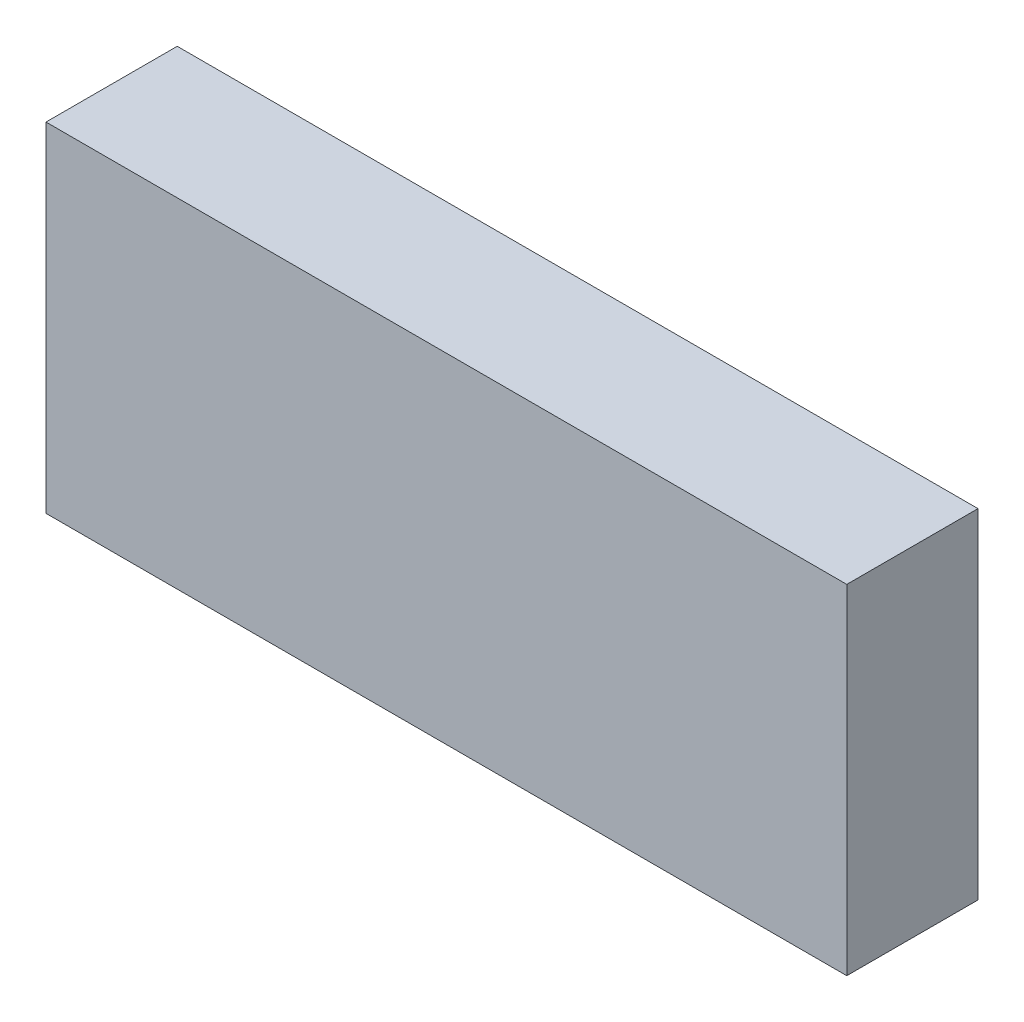
ISO-10303-21;
HEADER;
FILE_DESCRIPTION(('STEP AP214'),'2;1');
FILE_NAME('part.step','',(''),(''),'','','');
FILE_SCHEMA(('AUTOMOTIVE_DESIGN { 1 0 10303 214 1 1 1 1 }'));
ENDSEC;
DATA;
#1=APPLICATION_CONTEXT('core data for automotive mechanical design processes');
#2=APPLICATION_PROTOCOL_DEFINITION('international standard','automotive_design',2000,#1);
#3=PRODUCT_CONTEXT('',#1,'mechanical');
#4=PRODUCT('Part','Part','',(#3));
#5=PRODUCT_RELATED_PRODUCT_CATEGORY('part','',(#4));
#6=PRODUCT_DEFINITION_FORMATION('','',#4);
#7=PRODUCT_DEFINITION_CONTEXT('part definition',#1,'design');
#8=PRODUCT_DEFINITION('design','',#6,#7);
#9=PRODUCT_DEFINITION_SHAPE('','',#8);
#10=(LENGTH_UNIT() NAMED_UNIT(*) SI_UNIT(.MILLI.,.METRE.));
#11=(NAMED_UNIT(*) PLANE_ANGLE_UNIT() SI_UNIT($,.RADIAN.));
#12=(NAMED_UNIT(*) SI_UNIT($,.STERADIAN.) SOLID_ANGLE_UNIT());
#13=UNCERTAINTY_MEASURE_WITH_UNIT(LENGTH_MEASURE(1.E-05),#10,'distance_accuracy_value','');
#14=(GEOMETRIC_REPRESENTATION_CONTEXT(3) GLOBAL_UNCERTAINTY_ASSIGNED_CONTEXT((#13)) GLOBAL_UNIT_ASSIGNED_CONTEXT((#10,
#11,#12)) REPRESENTATION_CONTEXT('',''));
#15=CARTESIAN_POINT('',(0.,0.,0.));
#16=DIRECTION('',(0.,0.,1.));
#17=DIRECTION('',(1.,0.,0.));
#18=AXIS2_PLACEMENT_3D('',#15,#16,#17);
#19=CARTESIAN_POINT('',(28.4657285165292,1.,-13.5732649363504));
#20=DIRECTION('',(1.,0.,0.));
#21=DIRECTION('',(0.,0.,-1.));
#22=AXIS2_PLACEMENT_3D('',#19,#20,#21);
#23=PLANE('',#22);
#24=DIRECTION('',(0.,0.,1.));
#25=VECTOR('',#24,1.);
#26=CARTESIAN_POINT('',(28.4657285165292,0.,-13.5732649363504));
#27=LINE('',#26,#25);
#28=CARTESIAN_POINT('',(28.4657285165292,0.,-13.5732649363504));
#29=VERTEX_POINT('',#28);
#30=CARTESIAN_POINT('',(28.4657285165292,0.,-13.1860869579602));
#31=VERTEX_POINT('',#30);
#32=EDGE_CURVE('E11',#29,#31,#27,.T.);
#33=ORIENTED_EDGE('',*,*,#32,.T.);
#34=DIRECTION('',(0.,-1.,0.));
#35=VECTOR('',#34,1.);
#36=CARTESIAN_POINT('',(28.4657285165292,1.,-13.1860869579602));
#37=LINE('',#36,#35);
#38=CARTESIAN_POINT('',(28.4657285165292,1.,-13.1860869579602));
#39=VERTEX_POINT('',#38);
#40=EDGE_CURVE('E110',#39,#31,#37,.T.);
#41=ORIENTED_EDGE('',*,*,#40,.F.);
#42=DIRECTION('',(0.,0.,1.));
#43=VECTOR('',#42,1.);
#44=CARTESIAN_POINT('',(28.4657285165292,1.,-13.5732649363504));
#45=LINE('',#44,#43);
#46=CARTESIAN_POINT('',(28.4657285165292,1.,-13.5732649363504));
#47=VERTEX_POINT('',#46);
#48=EDGE_CURVE('E43',#47,#39,#45,.T.);
#49=ORIENTED_EDGE('',*,*,#48,.F.);
#50=DIRECTION('',(0.,-1.,0.));
#51=VECTOR('',#50,1.);
#52=CARTESIAN_POINT('',(28.4657285165292,1.,-13.5732649363504));
#53=LINE('',#52,#51);
#54=EDGE_CURVE('E83',#47,#29,#53,.T.);
#55=ORIENTED_EDGE('',*,*,#54,.T.);
#56=EDGE_LOOP('',(#33,#41,#49,#55));
#57=FACE_BOUND('',#56,.T.);
#58=ADVANCED_FACE('F39',(#57),#23,.F.);
#59=CARTESIAN_POINT('',(28.4657285165292,1.,-13.1860869579602));
#60=DIRECTION('',(0.,0.,-1.));
#61=DIRECTION('',(-1.,0.,0.));
#62=AXIS2_PLACEMENT_3D('',#59,#60,#61);
#63=PLANE('',#62);
#64=DIRECTION('',(1.,0.,0.));
#65=VECTOR('',#64,1.);
#66=CARTESIAN_POINT('',(28.4657285165292,0.,-13.1860869579602));
#67=LINE('',#66,#65);
#68=CARTESIAN_POINT('',(30.8285069487563,0.,-13.1860869579602));
#69=VERTEX_POINT('',#68);
#70=EDGE_CURVE('E49',#31,#69,#67,.T.);
#71=ORIENTED_EDGE('',*,*,#70,.T.);
#72=DIRECTION('',(0.,-1.,0.));
#73=VECTOR('',#72,1.);
#74=CARTESIAN_POINT('',(30.8285069487563,1.,-13.1860869579602));
#75=LINE('',#74,#73);
#76=CARTESIAN_POINT('',(30.8285069487563,1.,-13.1860869579602));
#77=VERTEX_POINT('',#76);
#78=EDGE_CURVE('E97',#77,#69,#75,.T.);
#79=ORIENTED_EDGE('',*,*,#78,.F.);
#80=DIRECTION('',(1.,0.,0.));
#81=VECTOR('',#80,1.);
#82=CARTESIAN_POINT('',(28.4657285165292,1.,-13.1860869579602));
#83=LINE('',#82,#81);
#84=EDGE_CURVE('E75',#39,#77,#83,.T.);
#85=ORIENTED_EDGE('',*,*,#84,.F.);
#86=ORIENTED_EDGE('',*,*,#40,.T.);
#87=EDGE_LOOP('',(#71,#79,#85,#86));
#88=FACE_BOUND('',#87,.T.);
#89=ADVANCED_FACE('F113',(#88),#63,.F.);
#90=CARTESIAN_POINT('',(30.8285069487563,1.,-13.5732649363504));
#91=DIRECTION('',(1.,0.,0.));
#92=DIRECTION('',(0.,0.,-1.));
#93=AXIS2_PLACEMENT_3D('',#90,#91,#92);
#94=PLANE('',#93);
#95=DIRECTION('',(0.,0.,1.));
#96=VECTOR('',#95,1.);
#97=CARTESIAN_POINT('',(30.8285069487563,0.,-13.5732649363504));
#98=LINE('',#97,#96);
#99=CARTESIAN_POINT('',(30.8285069487563,0.,-13.5732649363504));
#100=VERTEX_POINT('',#99);
#101=EDGE_CURVE('E99',#100,#69,#98,.T.);
#102=ORIENTED_EDGE('',*,*,#101,.F.);
#103=DIRECTION('',(0.,-1.,0.));
#104=VECTOR('',#103,1.);
#105=CARTESIAN_POINT('',(30.8285069487563,1.,-13.5732649363504));
#106=LINE('',#105,#104);
#107=CARTESIAN_POINT('',(30.8285069487563,1.,-13.5732649363504));
#108=VERTEX_POINT('',#107);
#109=EDGE_CURVE('E88',#108,#100,#106,.T.);
#110=ORIENTED_EDGE('',*,*,#109,.F.);
#111=DIRECTION('',(0.,0.,1.));
#112=VECTOR('',#111,1.);
#113=CARTESIAN_POINT('',(30.8285069487563,1.,-13.5732649363504));
#114=LINE('',#113,#112);
#115=EDGE_CURVE('E108',#108,#77,#114,.T.);
#116=ORIENTED_EDGE('',*,*,#115,.T.);
#117=ORIENTED_EDGE('',*,*,#78,.T.);
#118=EDGE_LOOP('',(#102,#110,#116,#117));
#119=FACE_BOUND('',#118,.T.);
#120=ADVANCED_FACE('F100',(#119),#94,.T.);
#121=CARTESIAN_POINT('',(28.4657285165292,1.,-13.5732649363504));
#122=DIRECTION('',(0.,0.,-1.));
#123=DIRECTION('',(-1.,0.,0.));
#124=AXIS2_PLACEMENT_3D('',#121,#122,#123);
#125=PLANE('',#124);
#126=DIRECTION('',(1.,0.,0.));
#127=VECTOR('',#126,1.);
#128=CARTESIAN_POINT('',(28.4657285165292,0.,-13.5732649363504));
#129=LINE('',#128,#127);
#130=EDGE_CURVE('E92',#29,#100,#129,.T.);
#131=ORIENTED_EDGE('',*,*,#130,.F.);
#132=ORIENTED_EDGE('',*,*,#54,.F.);
#133=DIRECTION('',(1.,0.,0.));
#134=VECTOR('',#133,1.);
#135=CARTESIAN_POINT('',(28.4657285165292,1.,-13.5732649363504));
#136=LINE('',#135,#134);
#137=EDGE_CURVE('E94',#47,#108,#136,.T.);
#138=ORIENTED_EDGE('',*,*,#137,.T.);
#139=ORIENTED_EDGE('',*,*,#109,.T.);
#140=EDGE_LOOP('',(#131,#132,#138,#139));
#141=FACE_BOUND('',#140,.T.);
#142=ADVANCED_FACE('F90',(#141),#125,.T.);
#143=CARTESIAN_POINT('',(0.,1.,0.));
#144=DIRECTION('',(0.,1.,0.));
#145=DIRECTION('',(0.,0.,1.));
#146=AXIS2_PLACEMENT_3D('',#143,#144,#145);
#147=PLANE('',#146);
#148=ORIENTED_EDGE('',*,*,#48,.T.);
#149=ORIENTED_EDGE('',*,*,#84,.T.);
#150=ORIENTED_EDGE('',*,*,#115,.F.);
#151=ORIENTED_EDGE('',*,*,#137,.F.);
#152=EDGE_LOOP('',(#148,#149,#150,#151));
#153=FACE_BOUND('',#152,.T.);
#154=ADVANCED_FACE('F41',(#153),#147,.T.);
#155=CARTESIAN_POINT('',(0.,0.,0.));
#156=DIRECTION('',(0.,1.,0.));
#157=DIRECTION('',(0.,0.,1.));
#158=AXIS2_PLACEMENT_3D('',#155,#156,#157);
#159=PLANE('',#158);
#160=ORIENTED_EDGE('',*,*,#32,.F.);
#161=ORIENTED_EDGE('',*,*,#130,.T.);
#162=ORIENTED_EDGE('',*,*,#101,.T.);
#163=ORIENTED_EDGE('',*,*,#70,.F.);
#164=EDGE_LOOP('',(#160,#161,#162,#163));
#165=FACE_BOUND('',#164,.T.);
#166=ADVANCED_FACE('F102',(#165),#159,.F.);
#167=CLOSED_SHELL('',(#58,#89,#120,#142,#154,#166));
#168=MANIFOLD_SOLID_BREP('B2',#167);
#169=ADVANCED_BREP_SHAPE_REPRESENTATION('',(#18,#168),#14);
#170=SHAPE_DEFINITION_REPRESENTATION(#9,#169);
ENDSEC;
END-ISO-10303-21;
